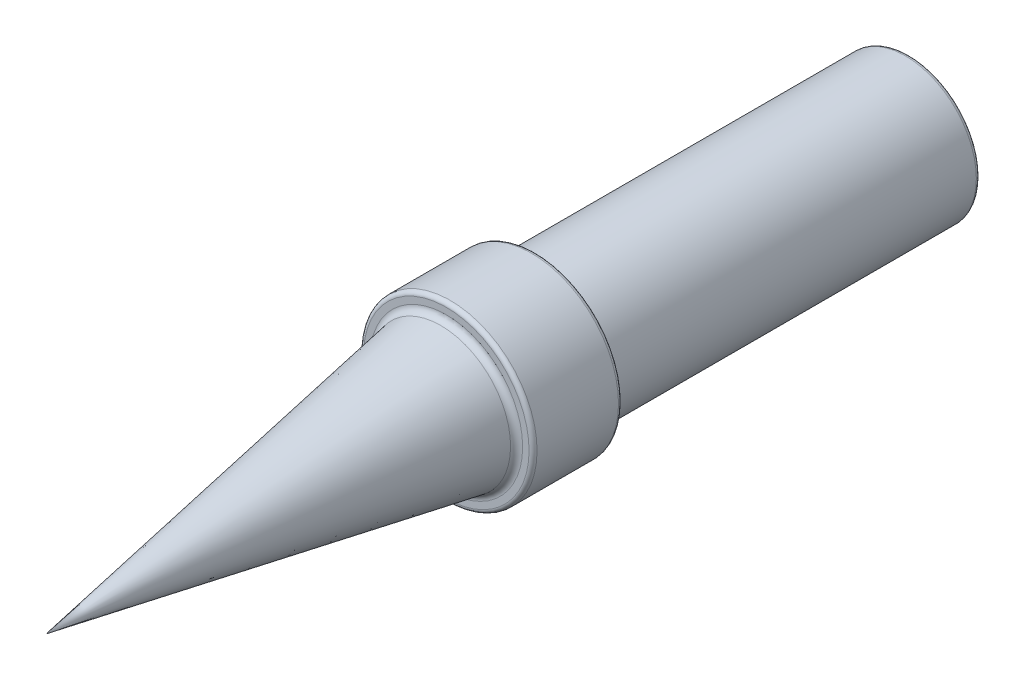
ISO-10303-21;
HEADER;
FILE_DESCRIPTION(('STEP AP214'),'2;1');
FILE_NAME('part.step','',(''),(''),'','','');
FILE_SCHEMA(('AUTOMOTIVE_DESIGN { 1 0 10303 214 1 1 1 1 }'));
ENDSEC;
DATA;
#1=APPLICATION_CONTEXT('core data for automotive mechanical design processes');
#2=APPLICATION_PROTOCOL_DEFINITION('international standard','automotive_design',2000,#1);
#3=PRODUCT_CONTEXT('',#1,'mechanical');
#4=PRODUCT('Part','Part','',(#3));
#5=PRODUCT_RELATED_PRODUCT_CATEGORY('part','',(#4));
#6=PRODUCT_DEFINITION_FORMATION('','',#4);
#7=PRODUCT_DEFINITION_CONTEXT('part definition',#1,'design');
#8=PRODUCT_DEFINITION('design','',#6,#7);
#9=PRODUCT_DEFINITION_SHAPE('','',#8);
#10=(LENGTH_UNIT() NAMED_UNIT(*) SI_UNIT(.MILLI.,.METRE.));
#11=(NAMED_UNIT(*) PLANE_ANGLE_UNIT() SI_UNIT($,.RADIAN.));
#12=(NAMED_UNIT(*) SI_UNIT($,.STERADIAN.) SOLID_ANGLE_UNIT());
#13=UNCERTAINTY_MEASURE_WITH_UNIT(LENGTH_MEASURE(1.E-05),#10,'distance_accuracy_value','');
#14=(GEOMETRIC_REPRESENTATION_CONTEXT(3) GLOBAL_UNCERTAINTY_ASSIGNED_CONTEXT((#13)) GLOBAL_UNIT_ASSIGNED_CONTEXT((#10,
#11,#12)) REPRESENTATION_CONTEXT('',''));
#15=CARTESIAN_POINT('',(0.,0.,0.));
#16=DIRECTION('',(0.,0.,1.));
#17=DIRECTION('',(1.,0.,0.));
#18=AXIS2_PLACEMENT_3D('',#15,#16,#17);
#19=CARTESIAN_POINT('',(0.,0.,14.));
#20=DIRECTION('',(0.,0.,-1.));
#21=DIRECTION('',(-1.,0.,0.));
#22=AXIS2_PLACEMENT_3D('',#19,#20,#21);
#23=CYLINDRICAL_SURFACE('',#22,2.65);
#24=CARTESIAN_POINT('',(0.,0.,0.150000000000001));
#25=DIRECTION('',(0.,0.,1.));
#26=DIRECTION('',(1.,0.,0.));
#27=AXIS2_PLACEMENT_3D('',#24,#25,#26);
#28=CIRCLE('',#27,2.65);
#29=CARTESIAN_POINT('',(2.65,0.,0.150000000000001));
#30=VERTEX_POINT('',#29);
#31=EDGE_CURVE('E106',#30,#30,#28,.T.);
#32=ORIENTED_EDGE('',*,*,#31,.T.);
#33=EDGE_LOOP('',(#32));
#34=FACE_BOUND('',#33,.T.);
#35=CARTESIAN_POINT('',(0.,0.,13.75));
#36=DIRECTION('',(0.,0.,1.));
#37=DIRECTION('',(1.,0.,0.));
#38=AXIS2_PLACEMENT_3D('',#35,#36,#37);
#39=CIRCLE('',#38,2.65);
#40=CARTESIAN_POINT('',(2.65,0.,13.75));
#41=VERTEX_POINT('',#40);
#42=EDGE_CURVE('E134',#41,#41,#39,.F.);
#43=ORIENTED_EDGE('',*,*,#42,.T.);
#44=EDGE_LOOP('',(#43));
#45=FACE_BOUND('',#44,.T.);
#46=ADVANCED_FACE('F37',(#34,#45),#23,.T.);
#47=CARTESIAN_POINT('',(0.,0.,0.));
#48=DIRECTION('',(0.,0.,1.));
#49=DIRECTION('',(1.,0.,0.));
#50=AXIS2_PLACEMENT_3D('',#47,#48,#49);
#51=PLANE('',#50);
#52=CARTESIAN_POINT('',(0.,0.,0.));
#53=DIRECTION('',(0.,0.,1.));
#54=DIRECTION('',(1.,0.,0.));
#55=AXIS2_PLACEMENT_3D('',#52,#53,#54);
#56=CIRCLE('',#55,2.5);
#57=CARTESIAN_POINT('',(2.5,0.,0.));
#58=VERTEX_POINT('',#57);
#59=EDGE_CURVE('E44',#58,#58,#56,.F.);
#60=ORIENTED_EDGE('',*,*,#59,.T.);
#61=EDGE_LOOP('',(#60));
#62=FACE_BOUND('',#61,.T.);
#63=CARTESIAN_POINT('',(0.,0.,0.));
#64=DIRECTION('',(0.,0.,1.));
#65=DIRECTION('',(1.,0.,0.));
#66=AXIS2_PLACEMENT_3D('',#63,#64,#65);
#67=CIRCLE('',#66,2.40813372332074);
#68=CARTESIAN_POINT('',(2.40813372332074,0.,0.));
#69=VERTEX_POINT('',#68);
#70=EDGE_CURVE('E107',#69,#69,#67,.T.);
#71=ORIENTED_EDGE('',*,*,#70,.T.);
#72=EDGE_LOOP('',(#71));
#73=FACE_BOUND('',#72,.T.);
#74=ADVANCED_FACE('F67',(#62,#73),#51,.F.);
#75=CARTESIAN_POINT('',(0.,0.,17.35));
#76=DIRECTION('',(0.,0.,-1.));
#77=DIRECTION('',(-1.,0.,0.));
#78=AXIS2_PLACEMENT_3D('',#75,#76,#77);
#79=CYLINDRICAL_SURFACE('',#78,3.25);
#80=CARTESIAN_POINT('',(0.,0.,14.15));
#81=DIRECTION('',(0.,0.,1.));
#82=DIRECTION('',(1.,0.,0.));
#83=AXIS2_PLACEMENT_3D('',#80,#81,#82);
#84=CIRCLE('',#83,3.25);
#85=CARTESIAN_POINT('',(3.25,0.,14.15));
#86=VERTEX_POINT('',#85);
#87=EDGE_CURVE('E149',#86,#86,#84,.T.);
#88=ORIENTED_EDGE('',*,*,#87,.T.);
#89=EDGE_LOOP('',(#88));
#90=FACE_BOUND('',#89,.T.);
#91=CARTESIAN_POINT('',(0.,0.,17.2));
#92=DIRECTION('',(0.,0.,1.));
#93=DIRECTION('',(1.,0.,0.));
#94=AXIS2_PLACEMENT_3D('',#91,#92,#93);
#95=CIRCLE('',#94,3.25);
#96=CARTESIAN_POINT('',(3.25,0.,17.2));
#97=VERTEX_POINT('',#96);
#98=EDGE_CURVE('E145',#97,#97,#95,.F.);
#99=ORIENTED_EDGE('',*,*,#98,.T.);
#100=EDGE_LOOP('',(#99));
#101=FACE_BOUND('',#100,.T.);
#102=ADVANCED_FACE('F73',(#90,#101),#79,.T.);
#103=CARTESIAN_POINT('',(0.,0.,17.35));
#104=DIRECTION('',(0.,0.,1.));
#105=DIRECTION('',(1.,0.,0.));
#106=AXIS2_PLACEMENT_3D('',#103,#104,#105);
#107=PLANE('',#106);
#108=CARTESIAN_POINT('',(0.,0.,17.35));
#109=DIRECTION('',(0.,0.,1.));
#110=DIRECTION('',(1.,0.,0.));
#111=AXIS2_PLACEMENT_3D('',#108,#109,#110);
#112=CIRCLE('',#111,3.1);
#113=CARTESIAN_POINT('',(3.1,0.,17.35));
#114=VERTEX_POINT('',#113);
#115=EDGE_CURVE('E108',#114,#114,#112,.T.);
#116=ORIENTED_EDGE('',*,*,#115,.T.);
#117=EDGE_LOOP('',(#116));
#118=FACE_BOUND('',#117,.T.);
#119=CARTESIAN_POINT('',(0.,0.,17.35));
#120=DIRECTION('',(0.,0.,1.));
#121=DIRECTION('',(1.,0.,0.));
#122=AXIS2_PLACEMENT_3D('',#119,#120,#121);
#123=CIRCLE('',#122,2.85968083331989);
#124=CARTESIAN_POINT('',(2.85968083331989,0.,17.35));
#125=VERTEX_POINT('',#124);
#126=EDGE_CURVE('E142',#125,#125,#123,.F.);
#127=ORIENTED_EDGE('',*,*,#126,.T.);
#128=EDGE_LOOP('',(#127));
#129=FACE_BOUND('',#128,.T.);
#130=ADVANCED_FACE('F60',(#118,#129),#107,.T.);
#131=CARTESIAN_POINT('',(0.,0.,14.));
#132=DIRECTION('',(0.,0.,1.));
#133=DIRECTION('',(1.,0.,0.));
#134=AXIS2_PLACEMENT_3D('',#131,#132,#133);
#135=PLANE('',#134);
#136=CARTESIAN_POINT('',(0.,0.,14.));
#137=DIRECTION('',(0.,0.,1.));
#138=DIRECTION('',(1.,0.,0.));
#139=AXIS2_PLACEMENT_3D('',#136,#137,#138);
#140=CIRCLE('',#139,3.1);
#141=CARTESIAN_POINT('',(3.1,0.,14.));
#142=VERTEX_POINT('',#141);
#143=EDGE_CURVE('E114',#142,#142,#140,.F.);
#144=ORIENTED_EDGE('',*,*,#143,.T.);
#145=EDGE_LOOP('',(#144));
#146=FACE_BOUND('',#145,.T.);
#147=CARTESIAN_POINT('',(0.,0.,14.));
#148=DIRECTION('',(0.,0.,1.));
#149=DIRECTION('',(1.,0.,0.));
#150=AXIS2_PLACEMENT_3D('',#147,#148,#149);
#151=CIRCLE('',#150,2.9);
#152=CARTESIAN_POINT('',(2.9,0.,14.));
#153=VERTEX_POINT('',#152);
#154=EDGE_CURVE('E128',#153,#153,#151,.T.);
#155=ORIENTED_EDGE('',*,*,#154,.T.);
#156=EDGE_LOOP('',(#155));
#157=FACE_BOUND('',#156,.T.);
#158=ADVANCED_FACE('F50',(#146,#157),#135,.F.);
#159=CARTESIAN_POINT('',(0.,0.,17.35));
#160=DIRECTION('',(0.,0.,-1.));
#161=DIRECTION('',(-1.,0.,0.));
#162=AXIS2_PLACEMENT_3D('',#159,#160,#161);
#163=CONICAL_SURFACE('',#162,2.65,0.174974648381311);
#164=CARTESIAN_POINT('',(0.,0.,17.5564792067185));
#165=DIRECTION('',(0.,0.,-1.));
#166=DIRECTION('',(-1.,0.,0.));
#167=AXIS2_PLACEMENT_3D('',#164,#165,#166);
#168=CIRCLE('',#167,2.61349809519199);
#169=CARTESIAN_POINT('',(-2.61349809519199,0.,17.5564792067185));
#170=VERTEX_POINT('',#169);
#171=EDGE_CURVE('E139',#170,#170,#168,.F.);
#172=ORIENTED_EDGE('',*,*,#171,.T.);
#173=EDGE_LOOP('',(#172));
#174=FACE_BOUND('',#173,.T.);
#175=CARTESIAN_POINT('',(0.,0.,32.3401738192017));
#176=VERTEX_POINT('',#175);
#177=VERTEX_LOOP('',#176);
#178=FACE_BOUND('',#177,.T.);
#179=ADVANCED_FACE('F47',(#174,#178),#163,.T.);
#180=CARTESIAN_POINT('',(0.,0.,13.75));
#181=DIRECTION('',(0.,0.,1.));
#182=DIRECTION('',(1.,0.,0.));
#183=AXIS2_PLACEMENT_3D('',#180,#181,#182);
#184=TOROIDAL_SURFACE('',#183,2.9,0.25);
#185=ORIENTED_EDGE('',*,*,#42,.F.);
#186=EDGE_LOOP('',(#185));
#187=FACE_BOUND('',#186,.T.);
#188=ORIENTED_EDGE('',*,*,#154,.F.);
#189=EDGE_LOOP('',(#188));
#190=FACE_BOUND('',#189,.T.);
#191=ADVANCED_FACE('F49',(#187,#190),#184,.F.);
#192=CARTESIAN_POINT('',(0.,0.,17.6));
#193=DIRECTION('',(0.,0.,1.));
#194=DIRECTION('',(1.,0.,0.));
#195=AXIS2_PLACEMENT_3D('',#192,#193,#194);
#196=TOROIDAL_SURFACE('',#195,2.85968083331989,0.25);
#197=ORIENTED_EDGE('',*,*,#126,.F.);
#198=EDGE_LOOP('',(#197));
#199=FACE_BOUND('',#198,.T.);
#200=ORIENTED_EDGE('',*,*,#171,.F.);
#201=EDGE_LOOP('',(#200));
#202=FACE_BOUND('',#201,.T.);
#203=ADVANCED_FACE('F57',(#199,#202),#196,.F.);
#204=CARTESIAN_POINT('',(0.,0.,14.15));
#205=DIRECTION('',(0.,0.,1.));
#206=DIRECTION('',(1.,0.,0.));
#207=AXIS2_PLACEMENT_3D('',#204,#205,#206);
#208=TOROIDAL_SURFACE('',#207,3.1,0.15);
#209=ORIENTED_EDGE('',*,*,#143,.F.);
#210=EDGE_LOOP('',(#209));
#211=FACE_BOUND('',#210,.T.);
#212=ORIENTED_EDGE('',*,*,#87,.F.);
#213=EDGE_LOOP('',(#212));
#214=FACE_BOUND('',#213,.T.);
#215=ADVANCED_FACE('F82',(#211,#214),#208,.T.);
#216=CARTESIAN_POINT('',(0.,0.,17.2));
#217=DIRECTION('',(0.,0.,1.));
#218=DIRECTION('',(1.,0.,0.));
#219=AXIS2_PLACEMENT_3D('',#216,#217,#218);
#220=TOROIDAL_SURFACE('',#219,3.1,0.15);
#221=ORIENTED_EDGE('',*,*,#98,.F.);
#222=EDGE_LOOP('',(#221));
#223=FACE_BOUND('',#222,.T.);
#224=ORIENTED_EDGE('',*,*,#115,.F.);
#225=EDGE_LOOP('',(#224));
#226=FACE_BOUND('',#225,.T.);
#227=ADVANCED_FACE('F86',(#223,#226),#220,.T.);
#228=CARTESIAN_POINT('',(0.,0.,14.));
#229=DIRECTION('',(0.,0.,-1.));
#230=DIRECTION('',(-1.,0.,0.));
#231=AXIS2_PLACEMENT_3D('',#228,#229,#230);
#232=CYLINDRICAL_SURFACE('',#231,2.25813372332074);
#233=CARTESIAN_POINT('',(0.,0.,0.150000000000001));
#234=DIRECTION('',(0.,0.,1.));
#235=DIRECTION('',(1.,0.,0.));
#236=AXIS2_PLACEMENT_3D('',#233,#234,#235);
#237=CIRCLE('',#236,2.25813372332074);
#238=CARTESIAN_POINT('',(2.25813372332074,0.,0.150000000000001));
#239=VERTEX_POINT('',#238);
#240=EDGE_CURVE('E11',#239,#239,#237,.F.);
#241=ORIENTED_EDGE('',*,*,#240,.T.);
#242=EDGE_LOOP('',(#241));
#243=FACE_BOUND('',#242,.T.);
#244=CARTESIAN_POINT('',(0.,0.,14.));
#245=DIRECTION('',(0.,0.,-1.));
#246=DIRECTION('',(-1.,0.,0.));
#247=AXIS2_PLACEMENT_3D('',#244,#245,#246);
#248=CIRCLE('',#247,2.25813372332074);
#249=CARTESIAN_POINT('',(-2.25813372332074,0.,14.));
#250=VERTEX_POINT('',#249);
#251=EDGE_CURVE('E126',#250,#250,#248,.T.);
#252=ORIENTED_EDGE('',*,*,#251,.F.);
#253=EDGE_LOOP('',(#252));
#254=FACE_BOUND('',#253,.T.);
#255=ADVANCED_FACE('F89',(#243,#254),#232,.F.);
#256=CARTESIAN_POINT('',(0.,0.,14.));
#257=DIRECTION('',(0.,0.,-1.));
#258=DIRECTION('',(-1.,0.,0.));
#259=AXIS2_PLACEMENT_3D('',#256,#257,#258);
#260=PLANE('',#259);
#261=ORIENTED_EDGE('',*,*,#251,.T.);
#262=EDGE_LOOP('',(#261));
#263=FACE_BOUND('',#262,.T.);
#264=ADVANCED_FACE('F93',(#263),#260,.T.);
#265=CARTESIAN_POINT('',(0.,0.,0.150000000000001));
#266=DIRECTION('',(0.,0.,1.));
#267=DIRECTION('',(1.,0.,0.));
#268=AXIS2_PLACEMENT_3D('',#265,#266,#267);
#269=TOROIDAL_SURFACE('',#268,2.5,0.15);
#270=ORIENTED_EDGE('',*,*,#59,.F.);
#271=EDGE_LOOP('',(#270));
#272=FACE_BOUND('',#271,.T.);
#273=ORIENTED_EDGE('',*,*,#31,.F.);
#274=EDGE_LOOP('',(#273));
#275=FACE_BOUND('',#274,.T.);
#276=ADVANCED_FACE('F91',(#272,#275),#269,.T.);
#277=CARTESIAN_POINT('',(0.,0.,0.150000000000001));
#278=DIRECTION('',(0.,0.,1.));
#279=DIRECTION('',(1.,0.,0.));
#280=AXIS2_PLACEMENT_3D('',#277,#278,#279);
#281=TOROIDAL_SURFACE('',#280,2.40813372332074,0.15);
#282=ORIENTED_EDGE('',*,*,#70,.F.);
#283=EDGE_LOOP('',(#282));
#284=FACE_BOUND('',#283,.T.);
#285=ORIENTED_EDGE('',*,*,#240,.F.);
#286=EDGE_LOOP('',(#285));
#287=FACE_BOUND('',#286,.T.);
#288=ADVANCED_FACE('F39',(#284,#287),#281,.T.);
#289=CLOSED_SHELL('',(#46,#74,#102,#130,#158,#179,#191,#203,#215,#227,#255,#264,#276,#288));
#290=MANIFOLD_SOLID_BREP('B2',#289);
#291=ADVANCED_BREP_SHAPE_REPRESENTATION('',(#18,#290),#14);
#292=SHAPE_DEFINITION_REPRESENTATION(#9,#291);
ENDSEC;
END-ISO-10303-21;
